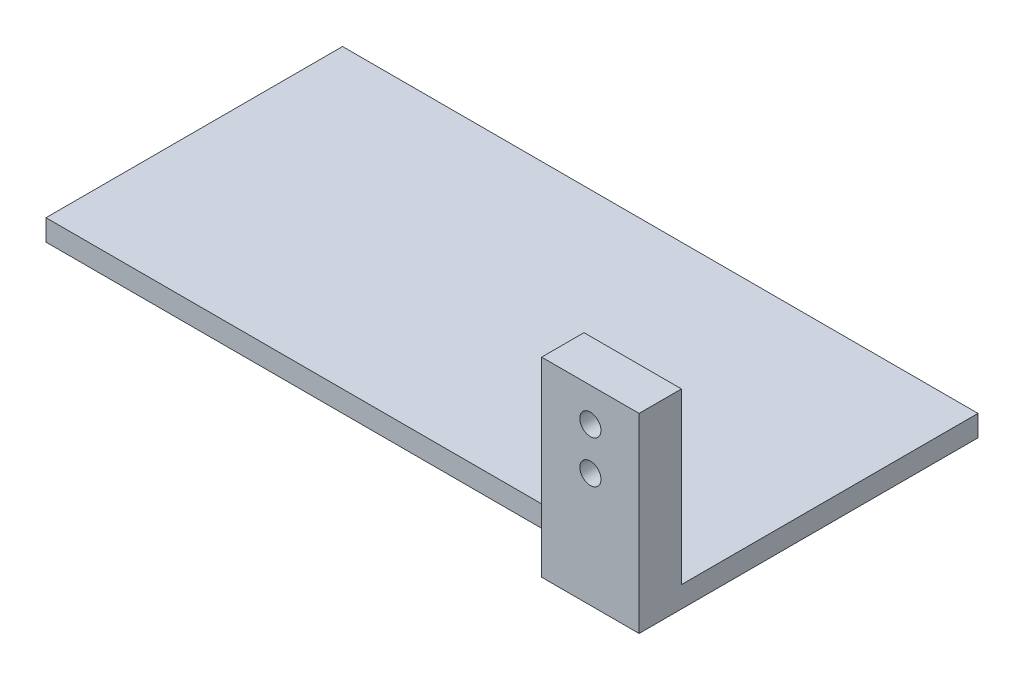
ISO-10303-21;
HEADER;
FILE_DESCRIPTION(('STEP AP214'),'2;1');
FILE_NAME('part.step','',(''),(''),'','','');
FILE_SCHEMA(('AUTOMOTIVE_DESIGN { 1 0 10303 214 1 1 1 1 }'));
ENDSEC;
DATA;
#1=APPLICATION_CONTEXT('core data for automotive mechanical design processes');
#2=APPLICATION_PROTOCOL_DEFINITION('international standard','automotive_design',2000,#1);
#3=PRODUCT_CONTEXT('',#1,'mechanical');
#4=PRODUCT('Part','Part','',(#3));
#5=PRODUCT_RELATED_PRODUCT_CATEGORY('part','',(#4));
#6=PRODUCT_DEFINITION_FORMATION('','',#4);
#7=PRODUCT_DEFINITION_CONTEXT('part definition',#1,'design');
#8=PRODUCT_DEFINITION('design','',#6,#7);
#9=PRODUCT_DEFINITION_SHAPE('','',#8);
#10=(LENGTH_UNIT() NAMED_UNIT(*) SI_UNIT(.MILLI.,.METRE.));
#11=(NAMED_UNIT(*) PLANE_ANGLE_UNIT() SI_UNIT($,.RADIAN.));
#12=(NAMED_UNIT(*) SI_UNIT($,.STERADIAN.) SOLID_ANGLE_UNIT());
#13=UNCERTAINTY_MEASURE_WITH_UNIT(LENGTH_MEASURE(1.E-05),#10,'distance_accuracy_value','');
#14=(GEOMETRIC_REPRESENTATION_CONTEXT(3) GLOBAL_UNCERTAINTY_ASSIGNED_CONTEXT((#13)) GLOBAL_UNIT_ASSIGNED_CONTEXT((#10,
#11,#12)) REPRESENTATION_CONTEXT('',''));
#15=CARTESIAN_POINT('',(0.,0.,0.));
#16=DIRECTION('',(0.,0.,1.));
#17=DIRECTION('',(1.,0.,0.));
#18=AXIS2_PLACEMENT_3D('',#15,#16,#17);
#19=CARTESIAN_POINT('',(11.5,40.,-5.));
#20=DIRECTION('',(-1.,0.,0.));
#21=DIRECTION('',(0.,0.,1.));
#22=AXIS2_PLACEMENT_3D('',#19,#20,#21);
#23=PLANE('',#22);
#24=DIRECTION('',(0.,-1.,0.));
#25=VECTOR('',#24,1.);
#26=CARTESIAN_POINT('',(11.5,40.,5.));
#27=LINE('',#26,#25);
#28=CARTESIAN_POINT('',(11.5,40.,5.));
#29=VERTEX_POINT('',#28);
#30=CARTESIAN_POINT('',(11.5,-5.,5.));
#31=VERTEX_POINT('',#30);
#32=EDGE_CURVE('E156',#29,#31,#27,.T.);
#33=ORIENTED_EDGE('',*,*,#32,.T.);
#34=DIRECTION('',(0.,0.,1.));
#35=VECTOR('',#34,1.);
#36=CARTESIAN_POINT('',(11.5,-5.,-5.));
#37=LINE('',#36,#35);
#38=CARTESIAN_POINT('',(11.5,-5.,-75.));
#39=VERTEX_POINT('',#38);
#40=EDGE_CURVE('E116',#39,#31,#37,.T.);
#41=ORIENTED_EDGE('',*,*,#40,.F.);
#42=DIRECTION('',(0.,1.,0.));
#43=VECTOR('',#42,1.);
#44=CARTESIAN_POINT('',(11.5,0.,-75.));
#45=LINE('',#44,#43);
#46=CARTESIAN_POINT('',(11.5,0.,-75.));
#47=VERTEX_POINT('',#46);
#48=EDGE_CURVE('E110',#39,#47,#45,.T.);
#49=ORIENTED_EDGE('',*,*,#48,.T.);
#50=DIRECTION('',(0.,0.,1.));
#51=VECTOR('',#50,1.);
#52=CARTESIAN_POINT('',(11.5,0.,-75.));
#53=LINE('',#52,#51);
#54=CARTESIAN_POINT('',(11.5,0.,-5.));
#55=VERTEX_POINT('',#54);
#56=EDGE_CURVE('E93',#47,#55,#53,.T.);
#57=ORIENTED_EDGE('',*,*,#56,.T.);
#58=DIRECTION('',(0.,-1.,0.));
#59=VECTOR('',#58,1.);
#60=CARTESIAN_POINT('',(11.5,40.,-5.));
#61=LINE('',#60,#59);
#62=CARTESIAN_POINT('',(11.5,40.,-5.));
#63=VERTEX_POINT('',#62);
#64=EDGE_CURVE('E11',#63,#55,#61,.T.);
#65=ORIENTED_EDGE('',*,*,#64,.F.);
#66=DIRECTION('',(0.,0.,-1.));
#67=VECTOR('',#66,1.);
#68=CARTESIAN_POINT('',(11.5,40.,-5.));
#69=LINE('',#68,#67);
#70=EDGE_CURVE('E141',#29,#63,#69,.T.);
#71=ORIENTED_EDGE('',*,*,#70,.F.);
#72=EDGE_LOOP('',(#33,#41,#49,#57,#65,#71));
#73=FACE_BOUND('',#72,.T.);
#74=ADVANCED_FACE('F32',(#73),#23,.F.);
#75=CARTESIAN_POINT('',(-11.5,40.,-5.));
#76=DIRECTION('',(0.,0.,1.));
#77=DIRECTION('',(1.,0.,0.));
#78=AXIS2_PLACEMENT_3D('',#75,#76,#77);
#79=PLANE('',#78);
#80=CARTESIAN_POINT('',(0.,32.,-5.));
#81=DIRECTION('',(0.,0.,1.));
#82=DIRECTION('',(1.,0.,0.));
#83=AXIS2_PLACEMENT_3D('',#80,#81,#82);
#84=CIRCLE('',#83,2.5);
#85=CARTESIAN_POINT('',(2.5,32.,-5.));
#86=VERTEX_POINT('',#85);
#87=EDGE_CURVE('E138',#86,#86,#84,.T.);
#88=ORIENTED_EDGE('',*,*,#87,.T.);
#89=EDGE_LOOP('',(#88));
#90=FACE_BOUND('',#89,.T.);
#91=CARTESIAN_POINT('',(0.,22.,-5.));
#92=DIRECTION('',(0.,0.,1.));
#93=DIRECTION('',(1.,0.,0.));
#94=AXIS2_PLACEMENT_3D('',#91,#92,#93);
#95=CIRCLE('',#94,2.5);
#96=CARTESIAN_POINT('',(2.5,22.,-5.));
#97=VERTEX_POINT('',#96);
#98=EDGE_CURVE('E145',#97,#97,#95,.T.);
#99=ORIENTED_EDGE('',*,*,#98,.T.);
#100=EDGE_LOOP('',(#99));
#101=FACE_BOUND('',#100,.T.);
#102=ORIENTED_EDGE('',*,*,#64,.T.);
#103=DIRECTION('',(-1.,0.,0.));
#104=VECTOR('',#103,1.);
#105=CARTESIAN_POINT('',(-138.5,0.,-5.));
#106=LINE('',#105,#104);
#107=CARTESIAN_POINT('',(-11.5,0.,-5.));
#108=VERTEX_POINT('',#107);
#109=EDGE_CURVE('E98',#55,#108,#106,.T.);
#110=ORIENTED_EDGE('',*,*,#109,.T.);
#111=DIRECTION('',(0.,-1.,0.));
#112=VECTOR('',#111,1.);
#113=CARTESIAN_POINT('',(-11.5,40.,-5.));
#114=LINE('',#113,#112);
#115=CARTESIAN_POINT('',(-11.5,40.,-5.));
#116=VERTEX_POINT('',#115);
#117=EDGE_CURVE('E39',#116,#108,#114,.T.);
#118=ORIENTED_EDGE('',*,*,#117,.F.);
#119=DIRECTION('',(-1.,0.,0.));
#120=VECTOR('',#119,1.);
#121=CARTESIAN_POINT('',(-11.5,40.,-5.));
#122=LINE('',#121,#120);
#123=EDGE_CURVE('E151',#63,#116,#122,.T.);
#124=ORIENTED_EDGE('',*,*,#123,.F.);
#125=EDGE_LOOP('',(#102,#110,#118,#124));
#126=FACE_BOUND('',#125,.T.);
#127=ADVANCED_FACE('F178',(#90,#101,#126),#79,.F.);
#128=CARTESIAN_POINT('',(-11.5,40.,-5.));
#129=DIRECTION('',(1.,0.,0.));
#130=DIRECTION('',(0.,0.,-1.));
#131=AXIS2_PLACEMENT_3D('',#128,#129,#130);
#132=PLANE('',#131);
#133=ORIENTED_EDGE('',*,*,#117,.T.);
#134=CARTESIAN_POINT('',(-11.5,-5.,-5.));
#135=VERTEX_POINT('',#134);
#136=EDGE_CURVE('E159',#108,#135,#114,.T.);
#137=ORIENTED_EDGE('',*,*,#136,.T.);
#138=DIRECTION('',(0.,0.,-1.));
#139=VECTOR('',#138,1.);
#140=CARTESIAN_POINT('',(-11.5,-5.,5.));
#141=LINE('',#140,#139);
#142=CARTESIAN_POINT('',(-11.5,-5.,5.));
#143=VERTEX_POINT('',#142);
#144=EDGE_CURVE('E134',#143,#135,#141,.T.);
#145=ORIENTED_EDGE('',*,*,#144,.F.);
#146=DIRECTION('',(0.,-1.,0.));
#147=VECTOR('',#146,1.);
#148=CARTESIAN_POINT('',(-11.5,40.,5.));
#149=LINE('',#148,#147);
#150=CARTESIAN_POINT('',(-11.5,40.,5.));
#151=VERTEX_POINT('',#150);
#152=EDGE_CURVE('E158',#151,#143,#149,.T.);
#153=ORIENTED_EDGE('',*,*,#152,.F.);
#154=DIRECTION('',(0.,0.,1.));
#155=VECTOR('',#154,1.);
#156=CARTESIAN_POINT('',(-11.5,40.,-5.));
#157=LINE('',#156,#155);
#158=EDGE_CURVE('E153',#116,#151,#157,.T.);
#159=ORIENTED_EDGE('',*,*,#158,.F.);
#160=EDGE_LOOP('',(#133,#137,#145,#153,#159));
#161=FACE_BOUND('',#160,.T.);
#162=ADVANCED_FACE('F166',(#161),#132,.F.);
#163=CARTESIAN_POINT('',(-11.5,40.,5.));
#164=DIRECTION('',(0.,0.,-1.));
#165=DIRECTION('',(-1.,0.,0.));
#166=AXIS2_PLACEMENT_3D('',#163,#164,#165);
#167=PLANE('',#166);
#168=CARTESIAN_POINT('',(0.,32.,5.));
#169=DIRECTION('',(0.,0.,1.));
#170=DIRECTION('',(1.,0.,0.));
#171=AXIS2_PLACEMENT_3D('',#168,#169,#170);
#172=CIRCLE('',#171,2.5);
#173=CARTESIAN_POINT('',(2.5,32.,5.));
#174=VERTEX_POINT('',#173);
#175=EDGE_CURVE('E142',#174,#174,#172,.T.);
#176=ORIENTED_EDGE('',*,*,#175,.F.);
#177=EDGE_LOOP('',(#176));
#178=FACE_BOUND('',#177,.T.);
#179=CARTESIAN_POINT('',(0.,22.,5.));
#180=DIRECTION('',(0.,0.,1.));
#181=DIRECTION('',(1.,0.,0.));
#182=AXIS2_PLACEMENT_3D('',#179,#180,#181);
#183=CIRCLE('',#182,2.5);
#184=CARTESIAN_POINT('',(2.5,22.,5.));
#185=VERTEX_POINT('',#184);
#186=EDGE_CURVE('E137',#185,#185,#183,.T.);
#187=ORIENTED_EDGE('',*,*,#186,.F.);
#188=EDGE_LOOP('',(#187));
#189=FACE_BOUND('',#188,.T.);
#190=ORIENTED_EDGE('',*,*,#152,.T.);
#191=DIRECTION('',(-1.,0.,0.));
#192=VECTOR('',#191,1.);
#193=CARTESIAN_POINT('',(11.5,-5.,5.));
#194=LINE('',#193,#192);
#195=EDGE_CURVE('E131',#31,#143,#194,.T.);
#196=ORIENTED_EDGE('',*,*,#195,.F.);
#197=ORIENTED_EDGE('',*,*,#32,.F.);
#198=DIRECTION('',(1.,0.,0.));
#199=VECTOR('',#198,1.);
#200=CARTESIAN_POINT('',(-11.5,40.,5.));
#201=LINE('',#200,#199);
#202=EDGE_CURVE('E54',#151,#29,#201,.T.);
#203=ORIENTED_EDGE('',*,*,#202,.F.);
#204=EDGE_LOOP('',(#190,#196,#197,#203));
#205=FACE_BOUND('',#204,.T.);
#206=ADVANCED_FACE('F174',(#178,#189,#205),#167,.F.);
#207=CARTESIAN_POINT('',(0.,40.,0.));
#208=DIRECTION('',(0.,1.,0.));
#209=DIRECTION('',(0.,0.,1.));
#210=AXIS2_PLACEMENT_3D('',#207,#208,#209);
#211=PLANE('',#210);
#212=ORIENTED_EDGE('',*,*,#70,.T.);
#213=ORIENTED_EDGE('',*,*,#123,.T.);
#214=ORIENTED_EDGE('',*,*,#158,.T.);
#215=ORIENTED_EDGE('',*,*,#202,.T.);
#216=EDGE_LOOP('',(#212,#213,#214,#215));
#217=FACE_BOUND('',#216,.T.);
#218=ADVANCED_FACE('F176',(#217),#211,.T.);
#219=CARTESIAN_POINT('',(0.,22.,-5.));
#220=DIRECTION('',(0.,0.,1.));
#221=DIRECTION('',(1.,0.,0.));
#222=AXIS2_PLACEMENT_3D('',#219,#220,#221);
#223=CYLINDRICAL_SURFACE('',#222,2.5);
#224=ORIENTED_EDGE('',*,*,#98,.F.);
#225=EDGE_LOOP('',(#224));
#226=FACE_BOUND('',#225,.T.);
#227=ORIENTED_EDGE('',*,*,#186,.T.);
#228=EDGE_LOOP('',(#227));
#229=FACE_BOUND('',#228,.T.);
#230=ADVANCED_FACE('F193',(#226,#229),#223,.F.);
#231=CARTESIAN_POINT('',(0.,32.,-5.));
#232=DIRECTION('',(0.,0.,1.));
#233=DIRECTION('',(1.,0.,0.));
#234=AXIS2_PLACEMENT_3D('',#231,#232,#233);
#235=CYLINDRICAL_SURFACE('',#234,2.5);
#236=ORIENTED_EDGE('',*,*,#87,.F.);
#237=EDGE_LOOP('',(#236));
#238=FACE_BOUND('',#237,.T.);
#239=ORIENTED_EDGE('',*,*,#175,.T.);
#240=EDGE_LOOP('',(#239));
#241=FACE_BOUND('',#240,.T.);
#242=ADVANCED_FACE('F196',(#238,#241),#235,.F.);
#243=CARTESIAN_POINT('',(0.,-5.,0.));
#244=DIRECTION('',(0.,-1.,0.));
#245=DIRECTION('',(0.,0.,-1.));
#246=AXIS2_PLACEMENT_3D('',#243,#244,#245);
#247=PLANE('',#246);
#248=ORIENTED_EDGE('',*,*,#144,.T.);
#249=DIRECTION('',(1.,0.,0.));
#250=VECTOR('',#249,1.);
#251=CARTESIAN_POINT('',(-138.5,-5.,-5.));
#252=LINE('',#251,#250);
#253=CARTESIAN_POINT('',(-138.5,-5.,-5.));
#254=VERTEX_POINT('',#253);
#255=EDGE_CURVE('E117',#254,#135,#252,.T.);
#256=ORIENTED_EDGE('',*,*,#255,.F.);
#257=DIRECTION('',(0.,0.,1.));
#258=VECTOR('',#257,1.);
#259=CARTESIAN_POINT('',(-138.5,-5.,-75.));
#260=LINE('',#259,#258);
#261=CARTESIAN_POINT('',(-138.5,-5.,-75.));
#262=VERTEX_POINT('',#261);
#263=EDGE_CURVE('E127',#262,#254,#260,.T.);
#264=ORIENTED_EDGE('',*,*,#263,.F.);
#265=DIRECTION('',(1.,0.,0.));
#266=VECTOR('',#265,1.);
#267=CARTESIAN_POINT('',(-138.5,-5.,-75.));
#268=LINE('',#267,#266);
#269=EDGE_CURVE('E103',#262,#39,#268,.T.);
#270=ORIENTED_EDGE('',*,*,#269,.T.);
#271=ORIENTED_EDGE('',*,*,#40,.T.);
#272=ORIENTED_EDGE('',*,*,#195,.T.);
#273=EDGE_LOOP('',(#248,#256,#264,#270,#271,#272));
#274=FACE_BOUND('',#273,.T.);
#275=ADVANCED_FACE('F171',(#274),#247,.T.);
#276=CARTESIAN_POINT('',(0.,0.,-5.));
#277=DIRECTION('',(0.,0.,1.));
#278=DIRECTION('',(1.,0.,0.));
#279=AXIS2_PLACEMENT_3D('',#276,#277,#278);
#280=PLANE('',#279);
#281=ORIENTED_EDGE('',*,*,#136,.F.);
#282=CARTESIAN_POINT('',(-138.5,0.,-5.));
#283=VERTEX_POINT('',#282);
#284=EDGE_CURVE('E46',#108,#283,#106,.T.);
#285=ORIENTED_EDGE('',*,*,#284,.T.);
#286=DIRECTION('',(0.,-1.,0.));
#287=VECTOR('',#286,1.);
#288=CARTESIAN_POINT('',(-138.5,0.,-5.));
#289=LINE('',#288,#287);
#290=EDGE_CURVE('E119',#283,#254,#289,.T.);
#291=ORIENTED_EDGE('',*,*,#290,.T.);
#292=ORIENTED_EDGE('',*,*,#255,.T.);
#293=EDGE_LOOP('',(#281,#285,#291,#292));
#294=FACE_BOUND('',#293,.T.);
#295=ADVANCED_FACE('F203',(#294),#280,.T.);
#296=CARTESIAN_POINT('',(-138.5,0.,-75.));
#297=DIRECTION('',(-1.,0.,0.));
#298=DIRECTION('',(0.,0.,1.));
#299=AXIS2_PLACEMENT_3D('',#296,#297,#298);
#300=PLANE('',#299);
#301=ORIENTED_EDGE('',*,*,#290,.F.);
#302=DIRECTION('',(0.,0.,1.));
#303=VECTOR('',#302,1.);
#304=CARTESIAN_POINT('',(-138.5,0.,-75.));
#305=LINE('',#304,#303);
#306=CARTESIAN_POINT('',(-138.5,0.,-75.));
#307=VERTEX_POINT('',#306);
#308=EDGE_CURVE('E102',#307,#283,#305,.T.);
#309=ORIENTED_EDGE('',*,*,#308,.F.);
#310=DIRECTION('',(0.,-1.,0.));
#311=VECTOR('',#310,1.);
#312=CARTESIAN_POINT('',(-138.5,0.,-75.));
#313=LINE('',#312,#311);
#314=EDGE_CURVE('E113',#307,#262,#313,.T.);
#315=ORIENTED_EDGE('',*,*,#314,.T.);
#316=ORIENTED_EDGE('',*,*,#263,.T.);
#317=EDGE_LOOP('',(#301,#309,#315,#316));
#318=FACE_BOUND('',#317,.T.);
#319=ADVANCED_FACE('F206',(#318),#300,.T.);
#320=CARTESIAN_POINT('',(-138.5,0.,-75.));
#321=DIRECTION('',(0.,1.,0.));
#322=DIRECTION('',(0.,0.,1.));
#323=AXIS2_PLACEMENT_3D('',#320,#321,#322);
#324=PLANE('',#323);
#325=ORIENTED_EDGE('',*,*,#109,.F.);
#326=ORIENTED_EDGE('',*,*,#56,.F.);
#327=DIRECTION('',(-1.,0.,0.));
#328=VECTOR('',#327,1.);
#329=CARTESIAN_POINT('',(-138.5,0.,-75.));
#330=LINE('',#329,#328);
#331=EDGE_CURVE('E96',#47,#307,#330,.T.);
#332=ORIENTED_EDGE('',*,*,#331,.T.);
#333=ORIENTED_EDGE('',*,*,#308,.T.);
#334=ORIENTED_EDGE('',*,*,#284,.F.);
#335=EDGE_LOOP('',(#325,#326,#332,#333,#334));
#336=FACE_BOUND('',#335,.T.);
#337=ADVANCED_FACE('F95',(#336),#324,.T.);
#338=CARTESIAN_POINT('',(0.,0.,-75.));
#339=DIRECTION('',(0.,0.,1.));
#340=DIRECTION('',(1.,0.,0.));
#341=AXIS2_PLACEMENT_3D('',#338,#339,#340);
#342=PLANE('',#341);
#343=ORIENTED_EDGE('',*,*,#48,.F.);
#344=ORIENTED_EDGE('',*,*,#269,.F.);
#345=ORIENTED_EDGE('',*,*,#314,.F.);
#346=ORIENTED_EDGE('',*,*,#331,.F.);
#347=EDGE_LOOP('',(#343,#344,#345,#346));
#348=FACE_BOUND('',#347,.T.);
#349=ADVANCED_FACE('F108',(#348),#342,.F.);
#350=CLOSED_SHELL('',(#74,#127,#162,#206,#218,#230,#242,#275,#295,#319,#337,#349));
#351=MANIFOLD_SOLID_BREP('B2',#350);
#352=ADVANCED_BREP_SHAPE_REPRESENTATION('',(#18,#351),#14);
#353=SHAPE_DEFINITION_REPRESENTATION(#9,#352);
ENDSEC;
END-ISO-10303-21;
